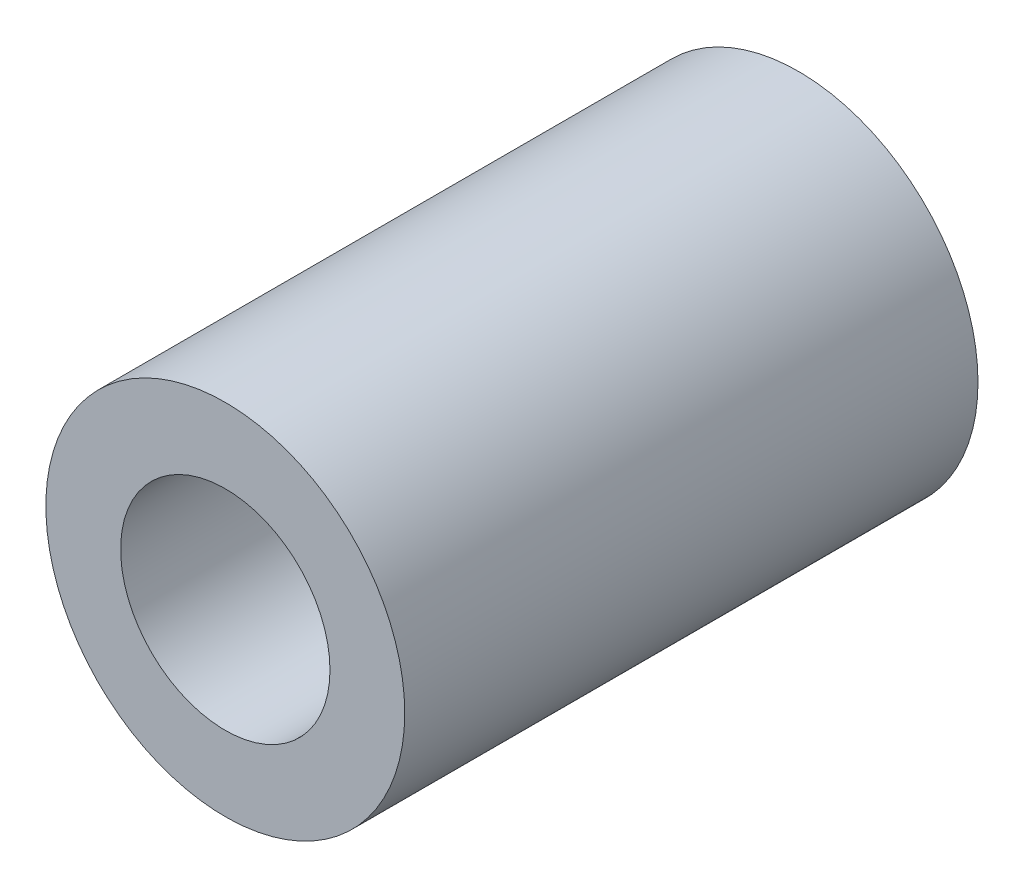
ISO-10303-21;
HEADER;
FILE_DESCRIPTION(('STEP AP214'),'2;1');
FILE_NAME('part.step','',(''),(''),'','','');
FILE_SCHEMA(('AUTOMOTIVE_DESIGN { 1 0 10303 214 1 1 1 1 }'));
ENDSEC;
DATA;
#1=APPLICATION_CONTEXT('core data for automotive mechanical design processes');
#2=APPLICATION_PROTOCOL_DEFINITION('international standard','automotive_design',2000,#1);
#3=PRODUCT_CONTEXT('',#1,'mechanical');
#4=PRODUCT('Part','Part','',(#3));
#5=PRODUCT_RELATED_PRODUCT_CATEGORY('part','',(#4));
#6=PRODUCT_DEFINITION_FORMATION('','',#4);
#7=PRODUCT_DEFINITION_CONTEXT('part definition',#1,'design');
#8=PRODUCT_DEFINITION('design','',#6,#7);
#9=PRODUCT_DEFINITION_SHAPE('','',#8);
#10=(LENGTH_UNIT() NAMED_UNIT(*) SI_UNIT(.MILLI.,.METRE.));
#11=(NAMED_UNIT(*) PLANE_ANGLE_UNIT() SI_UNIT($,.RADIAN.));
#12=(NAMED_UNIT(*) SI_UNIT($,.STERADIAN.) SOLID_ANGLE_UNIT());
#13=UNCERTAINTY_MEASURE_WITH_UNIT(LENGTH_MEASURE(1.E-05),#10,'distance_accuracy_value','');
#14=(GEOMETRIC_REPRESENTATION_CONTEXT(3) GLOBAL_UNCERTAINTY_ASSIGNED_CONTEXT((#13)) GLOBAL_UNIT_ASSIGNED_CONTEXT((#10,
#11,#12)) REPRESENTATION_CONTEXT('',''));
#15=CARTESIAN_POINT('',(0.,0.,0.));
#16=DIRECTION('',(0.,0.,1.));
#17=DIRECTION('',(1.,0.,0.));
#18=AXIS2_PLACEMENT_3D('',#15,#16,#17);
#19=CARTESIAN_POINT('',(0.,0.,11.5));
#20=DIRECTION('',(0.,0.,1.));
#21=DIRECTION('',(1.,0.,0.));
#22=AXIS2_PLACEMENT_3D('',#19,#20,#21);
#23=PLANE('',#22);
#24=CARTESIAN_POINT('',(0.,0.,11.5));
#25=DIRECTION('',(0.,0.,1.));
#26=DIRECTION('',(1.,0.,0.));
#27=AXIS2_PLACEMENT_3D('',#24,#25,#26);
#28=CIRCLE('',#27,3.6);
#29=CARTESIAN_POINT('',(3.6,0.,11.5));
#30=VERTEX_POINT('',#29);
#31=EDGE_CURVE('E10',#30,#30,#28,.T.);
#32=ORIENTED_EDGE('',*,*,#31,.T.);
#33=EDGE_LOOP('',(#32));
#34=FACE_BOUND('',#33,.T.);
#35=CARTESIAN_POINT('',(0.,0.,11.5));
#36=DIRECTION('',(0.,0.,1.));
#37=DIRECTION('',(1.,0.,0.));
#38=AXIS2_PLACEMENT_3D('',#35,#36,#37);
#39=CIRCLE('',#38,2.1);
#40=CARTESIAN_POINT('',(2.1,0.,11.5));
#41=VERTEX_POINT('',#40);
#42=EDGE_CURVE('E42',#41,#41,#39,.T.);
#43=ORIENTED_EDGE('',*,*,#42,.F.);
#44=EDGE_LOOP('',(#43));
#45=FACE_BOUND('',#44,.T.);
#46=ADVANCED_FACE('F31',(#34,#45),#23,.T.);
#47=CARTESIAN_POINT('',(0.,0.,0.));
#48=DIRECTION('',(0.,0.,1.));
#49=DIRECTION('',(1.,0.,0.));
#50=AXIS2_PLACEMENT_3D('',#47,#48,#49);
#51=PLANE('',#50);
#52=CARTESIAN_POINT('',(0.,0.,0.));
#53=DIRECTION('',(0.,0.,1.));
#54=DIRECTION('',(1.,0.,0.));
#55=AXIS2_PLACEMENT_3D('',#52,#53,#54);
#56=CIRCLE('',#55,3.6);
#57=CARTESIAN_POINT('',(3.6,0.,0.));
#58=VERTEX_POINT('',#57);
#59=EDGE_CURVE('E35',#58,#58,#56,.T.);
#60=ORIENTED_EDGE('',*,*,#59,.F.);
#61=EDGE_LOOP('',(#60));
#62=FACE_BOUND('',#61,.T.);
#63=CARTESIAN_POINT('',(0.,0.,0.));
#64=DIRECTION('',(0.,0.,1.));
#65=DIRECTION('',(1.,0.,0.));
#66=AXIS2_PLACEMENT_3D('',#63,#64,#65);
#67=CIRCLE('',#66,2.1);
#68=CARTESIAN_POINT('',(2.1,0.,0.));
#69=VERTEX_POINT('',#68);
#70=EDGE_CURVE('E44',#69,#69,#67,.T.);
#71=ORIENTED_EDGE('',*,*,#70,.T.);
#72=EDGE_LOOP('',(#71));
#73=FACE_BOUND('',#72,.T.);
#74=ADVANCED_FACE('F54',(#62,#73),#51,.F.);
#75=CARTESIAN_POINT('',(0.,0.,11.5));
#76=DIRECTION('',(0.,0.,-1.));
#77=DIRECTION('',(-1.,0.,0.));
#78=AXIS2_PLACEMENT_3D('',#75,#76,#77);
#79=CYLINDRICAL_SURFACE('',#78,3.6);
#80=ORIENTED_EDGE('',*,*,#31,.F.);
#81=EDGE_LOOP('',(#80));
#82=FACE_BOUND('',#81,.T.);
#83=ORIENTED_EDGE('',*,*,#59,.T.);
#84=EDGE_LOOP('',(#83));
#85=FACE_BOUND('',#84,.T.);
#86=ADVANCED_FACE('F33',(#82,#85),#79,.T.);
#87=CARTESIAN_POINT('',(0.,0.,11.5));
#88=DIRECTION('',(0.,0.,-1.));
#89=DIRECTION('',(-1.,0.,0.));
#90=AXIS2_PLACEMENT_3D('',#87,#88,#89);
#91=CYLINDRICAL_SURFACE('',#90,2.1);
#92=ORIENTED_EDGE('',*,*,#42,.T.);
#93=EDGE_LOOP('',(#92));
#94=FACE_BOUND('',#93,.T.);
#95=ORIENTED_EDGE('',*,*,#70,.F.);
#96=EDGE_LOOP('',(#95));
#97=FACE_BOUND('',#96,.T.);
#98=ADVANCED_FACE('F50',(#94,#97),#91,.F.);
#99=CLOSED_SHELL('',(#46,#74,#86,#98));
#100=MANIFOLD_SOLID_BREP('B2',#99);
#101=ADVANCED_BREP_SHAPE_REPRESENTATION('',(#18,#100),#14);
#102=SHAPE_DEFINITION_REPRESENTATION(#9,#101);
ENDSEC;
END-ISO-10303-21;
